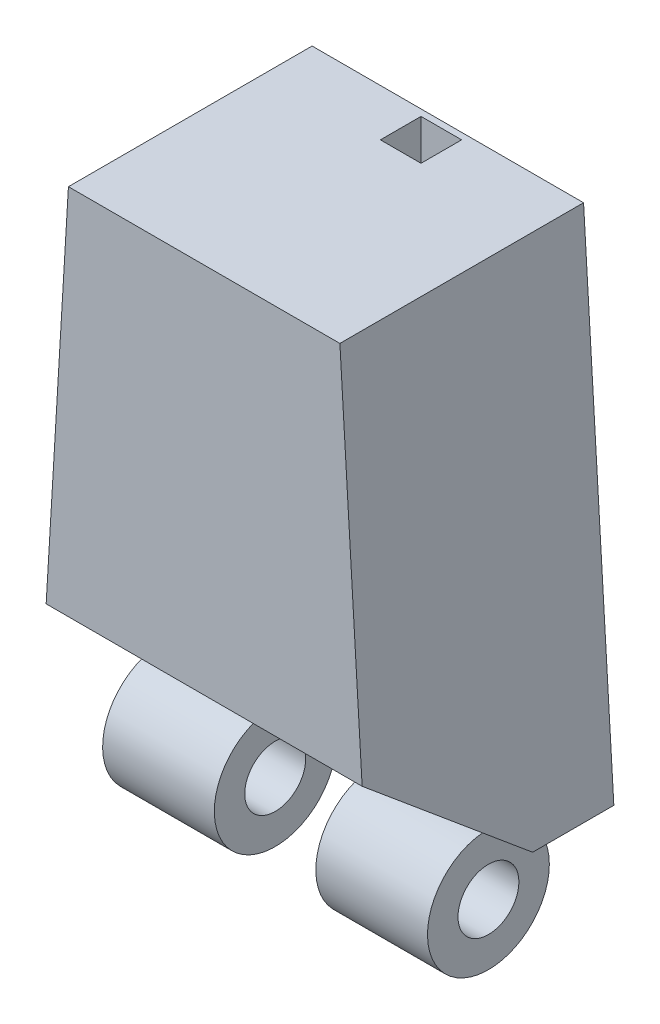
ISO-10303-21;
HEADER;
FILE_DESCRIPTION(('STEP AP214'),'2;1');
FILE_NAME('part.step','',(''),(''),'','','');
FILE_SCHEMA(('AUTOMOTIVE_DESIGN { 1 0 10303 214 1 1 1 1 }'));
ENDSEC;
DATA;
#1=APPLICATION_CONTEXT('core data for automotive mechanical design processes');
#2=APPLICATION_PROTOCOL_DEFINITION('international standard','automotive_design',2000,#1);
#3=PRODUCT_CONTEXT('',#1,'mechanical');
#4=PRODUCT('Part','Part','',(#3));
#5=PRODUCT_RELATED_PRODUCT_CATEGORY('part','',(#4));
#6=PRODUCT_DEFINITION_FORMATION('','',#4);
#7=PRODUCT_DEFINITION_CONTEXT('part definition',#1,'design');
#8=PRODUCT_DEFINITION('design','',#6,#7);
#9=PRODUCT_DEFINITION_SHAPE('','',#8);
#10=(LENGTH_UNIT() NAMED_UNIT(*) SI_UNIT(.MILLI.,.METRE.));
#11=(NAMED_UNIT(*) PLANE_ANGLE_UNIT() SI_UNIT($,.RADIAN.));
#12=(NAMED_UNIT(*) SI_UNIT($,.STERADIAN.) SOLID_ANGLE_UNIT());
#13=UNCERTAINTY_MEASURE_WITH_UNIT(LENGTH_MEASURE(1.E-05),#10,'distance_accuracy_value','');
#14=(GEOMETRIC_REPRESENTATION_CONTEXT(3) GLOBAL_UNCERTAINTY_ASSIGNED_CONTEXT((#13)) GLOBAL_UNIT_ASSIGNED_CONTEXT((#10,
#11,#12)) REPRESENTATION_CONTEXT('',''));
#15=CARTESIAN_POINT('',(0.,0.,0.));
#16=DIRECTION('',(0.,0.,1.));
#17=DIRECTION('',(1.,0.,0.));
#18=AXIS2_PLACEMENT_3D('',#15,#16,#17);
#19=CARTESIAN_POINT('',(-56.5742777997626,0.,12.));
#20=DIRECTION('',(0.,1.,0.));
#21=DIRECTION('',(0.,0.,1.));
#22=AXIS2_PLACEMENT_3D('',#19,#20,#21);
#23=PLANE('',#22);
#24=DIRECTION('',(1.,0.,0.));
#25=VECTOR('',#24,1.);
#26=CARTESIAN_POINT('',(-56.5742777997626,0.,4.));
#27=LINE('',#26,#25);
#28=CARTESIAN_POINT('',(-40.3975440170478,0.,4.));
#29=VERTEX_POINT('',#28);
#30=CARTESIAN_POINT('',(-40.2208102343331,0.,4.));
#31=VERTEX_POINT('',#30);
#32=EDGE_CURVE('E298',#29,#31,#27,.T.);
#33=ORIENTED_EDGE('',*,*,#32,.F.);
#34=DIRECTION('',(0.,0.,-1.));
#35=VECTOR('',#34,1.);
#36=CARTESIAN_POINT('',(-40.3975440170478,0.,12.));
#37=LINE('',#36,#35);
#38=CARTESIAN_POINT('',(-40.3975440170478,0.,3.20894285260943));
#39=VERTEX_POINT('',#38);
#40=EDGE_CURVE('E289',#29,#39,#37,.T.);
#41=ORIENTED_EDGE('',*,*,#40,.T.);
#42=DIRECTION('',(-1.,0.,0.));
#43=VECTOR('',#42,1.);
#44=CARTESIAN_POINT('',(-40.3975440170478,0.,3.20894285260943));
#45=LINE('',#44,#43);
#46=CARTESIAN_POINT('',(-45.8975440170478,0.,3.20894285260943));
#47=VERTEX_POINT('',#46);
#48=EDGE_CURVE('E293',#47,#39,#45,.F.);
#49=ORIENTED_EDGE('',*,*,#48,.F.);
#50=CARTESIAN_POINT('',(-50.8975440170478,0.,3.20894285260943));
#51=VERTEX_POINT('',#50);
#52=EDGE_CURVE('E299',#51,#47,#45,.F.);
#53=ORIENTED_EDGE('',*,*,#52,.F.);
#54=CARTESIAN_POINT('',(-56.3975440170478,0.,3.20894285260943));
#55=VERTEX_POINT('',#54);
#56=EDGE_CURVE('E294',#55,#51,#45,.F.);
#57=ORIENTED_EDGE('',*,*,#56,.F.);
#58=DIRECTION('',(0.,0.,-1.));
#59=VECTOR('',#58,1.);
#60=CARTESIAN_POINT('',(-56.3975440170478,0.,12.));
#61=LINE('',#60,#59);
#62=CARTESIAN_POINT('',(-56.3975440170478,0.,4.));
#63=VERTEX_POINT('',#62);
#64=EDGE_CURVE('E279',#63,#55,#61,.T.);
#65=ORIENTED_EDGE('',*,*,#64,.F.);
#66=CARTESIAN_POINT('',(-56.5742777997626,0.,4.));
#67=VERTEX_POINT('',#66);
#68=EDGE_CURVE('E300',#67,#63,#27,.T.);
#69=ORIENTED_EDGE('',*,*,#68,.F.);
#70=DIRECTION('',(0.,0.,-1.));
#71=VECTOR('',#70,1.);
#72=CARTESIAN_POINT('',(-56.5742777997626,0.,12.));
#73=LINE('',#72,#71);
#74=CARTESIAN_POINT('',(-56.5742777997626,0.,0.));
#75=VERTEX_POINT('',#74);
#76=EDGE_CURVE('E341',#67,#75,#73,.T.);
#77=ORIENTED_EDGE('',*,*,#76,.T.);
#78=DIRECTION('',(1.,0.,0.));
#79=VECTOR('',#78,1.);
#80=CARTESIAN_POINT('',(-56.5742777997626,0.,0.));
#81=LINE('',#80,#79);
#82=CARTESIAN_POINT('',(-40.2208102343331,0.,0.));
#83=VERTEX_POINT('',#82);
#84=EDGE_CURVE('E325',#75,#83,#81,.T.);
#85=ORIENTED_EDGE('',*,*,#84,.T.);
#86=DIRECTION('',(0.,0.,-1.));
#87=VECTOR('',#86,1.);
#88=CARTESIAN_POINT('',(-40.2208102343331,0.,12.));
#89=LINE('',#88,#87);
#90=EDGE_CURVE('E338',#31,#83,#89,.T.);
#91=ORIENTED_EDGE('',*,*,#90,.F.);
#92=EDGE_LOOP('',(#33,#41,#49,#53,#57,#65,#69,#77,#85,#91));
#93=FACE_BOUND('',#92,.T.);
#94=DIRECTION('',(0.,0.,1.));
#95=VECTOR('',#94,1.);
#96=CARTESIAN_POINT('',(-49.3975440170478,0.,0.));
#97=LINE('',#96,#95);
#98=CARTESIAN_POINT('',(-49.3975440170478,0.,0.32));
#99=VERTEX_POINT('',#98);
#100=CARTESIAN_POINT('',(-49.3975440170478,0.,2.32));
#101=VERTEX_POINT('',#100);
#102=EDGE_CURVE('E175',#99,#101,#97,.T.);
#103=ORIENTED_EDGE('',*,*,#102,.T.);
#104=DIRECTION('',(1.,0.,0.));
#105=VECTOR('',#104,1.);
#106=CARTESIAN_POINT('',(-49.3975440170478,0.,2.32));
#107=LINE('',#106,#105);
#108=CARTESIAN_POINT('',(-47.3975440170478,0.,2.32));
#109=VERTEX_POINT('',#108);
#110=EDGE_CURVE('E166',#101,#109,#107,.T.);
#111=ORIENTED_EDGE('',*,*,#110,.T.);
#112=DIRECTION('',(0.,0.,1.));
#113=VECTOR('',#112,1.);
#114=CARTESIAN_POINT('',(-47.3975440170478,0.,0.));
#115=LINE('',#114,#113);
#116=CARTESIAN_POINT('',(-47.3975440170478,0.,0.319999999999999));
#117=VERTEX_POINT('',#116);
#118=EDGE_CURVE('E194',#117,#109,#115,.T.);
#119=ORIENTED_EDGE('',*,*,#118,.F.);
#120=DIRECTION('',(1.,0.,0.));
#121=VECTOR('',#120,1.);
#122=CARTESIAN_POINT('',(-49.3975440170478,0.,0.32));
#123=LINE('',#122,#121);
#124=EDGE_CURVE('E56',#99,#117,#123,.T.);
#125=ORIENTED_EDGE('',*,*,#124,.F.);
#126=EDGE_LOOP('',(#103,#111,#119,#125));
#127=FACE_BOUND('',#126,.T.);
#128=ADVANCED_FACE('F40',(#93,#127),#23,.F.);
#129=CARTESIAN_POINT('',(-56.5742777997626,24.9554191747887,12.));
#130=DIRECTION('',(0.,-1.,0.));
#131=DIRECTION('',(0.,0.,-1.));
#132=AXIS2_PLACEMENT_3D('',#129,#130,#131);
#133=PLANE('',#132);
#134=DIRECTION('',(1.,0.,0.));
#135=VECTOR('',#134,1.);
#136=CARTESIAN_POINT('',(-56.5742777997626,24.9554191747887,12.));
#137=LINE('',#136,#135);
#138=CARTESIAN_POINT('',(-55.0819461306661,24.9554191747887,12.));
#139=VERTEX_POINT('',#138);
#140=CARTESIAN_POINT('',(-41.7131419034296,24.9554191747887,12.));
#141=VERTEX_POINT('',#140);
#142=EDGE_CURVE('E198',#139,#141,#137,.T.);
#143=ORIENTED_EDGE('',*,*,#142,.T.);
#144=DIRECTION('',(0.,0.,-1.));
#145=VECTOR('',#144,1.);
#146=CARTESIAN_POINT('',(-41.7131419034296,24.9554191747887,12.));
#147=LINE('',#146,#145);
#148=CARTESIAN_POINT('',(-41.7131419034296,24.9554191747887,0.));
#149=VERTEX_POINT('',#148);
#150=EDGE_CURVE('E335',#141,#149,#147,.T.);
#151=ORIENTED_EDGE('',*,*,#150,.T.);
#152=DIRECTION('',(1.,0.,0.));
#153=VECTOR('',#152,1.);
#154=CARTESIAN_POINT('',(-48.3975440170478,24.9554191747887,0.));
#155=LINE('',#154,#153);
#156=CARTESIAN_POINT('',(-55.0819461306661,24.9554191747887,0.));
#157=VERTEX_POINT('',#156);
#158=EDGE_CURVE('E364',#157,#149,#155,.T.);
#159=ORIENTED_EDGE('',*,*,#158,.F.);
#160=DIRECTION('',(0.,0.,-1.));
#161=VECTOR('',#160,1.);
#162=CARTESIAN_POINT('',(-55.0819461306661,24.9554191747887,12.));
#163=LINE('',#162,#161);
#164=EDGE_CURVE('E321',#139,#157,#163,.T.);
#165=ORIENTED_EDGE('',*,*,#164,.F.);
#166=EDGE_LOOP('',(#143,#151,#159,#165));
#167=FACE_BOUND('',#166,.T.);
#168=DIRECTION('',(0.,0.,1.));
#169=VECTOR('',#168,1.);
#170=CARTESIAN_POINT('',(-49.3975440170478,24.9554191747887,12.));
#171=LINE('',#170,#169);
#172=CARTESIAN_POINT('',(-49.3975440170478,24.9554191747887,0.32));
#173=VERTEX_POINT('',#172);
#174=CARTESIAN_POINT('',(-49.3975440170478,24.9554191747887,2.32));
#175=VERTEX_POINT('',#174);
#176=EDGE_CURVE('E11',#173,#175,#171,.T.);
#177=ORIENTED_EDGE('',*,*,#176,.F.);
#178=DIRECTION('',(-1.,0.,0.));
#179=VECTOR('',#178,1.);
#180=CARTESIAN_POINT('',(-56.5742777997626,24.9554191747887,0.320000000000001));
#181=LINE('',#180,#179);
#182=CARTESIAN_POINT('',(-47.3975440170478,24.9554191747887,0.32));
#183=VERTEX_POINT('',#182);
#184=EDGE_CURVE('E49',#183,#173,#181,.T.);
#185=ORIENTED_EDGE('',*,*,#184,.F.);
#186=DIRECTION('',(0.,0.,1.));
#187=VECTOR('',#186,1.);
#188=CARTESIAN_POINT('',(-47.3975440170478,24.9554191747887,12.));
#189=LINE('',#188,#187);
#190=CARTESIAN_POINT('',(-47.3975440170478,24.9554191747887,2.32));
#191=VERTEX_POINT('',#190);
#192=EDGE_CURVE('E368',#183,#191,#189,.T.);
#193=ORIENTED_EDGE('',*,*,#192,.T.);
#194=DIRECTION('',(1.,0.,0.));
#195=VECTOR('',#194,1.);
#196=CARTESIAN_POINT('',(-56.5742777997626,24.9554191747887,2.32));
#197=LINE('',#196,#195);
#198=EDGE_CURVE('E372',#175,#191,#197,.T.);
#199=ORIENTED_EDGE('',*,*,#198,.F.);
#200=EDGE_LOOP('',(#177,#185,#193,#199));
#201=FACE_BOUND('',#200,.T.);
#202=ADVANCED_FACE('F379',(#167,#201),#133,.F.);
#203=CARTESIAN_POINT('',(-56.5742777997626,-1.96433929006934,1.62400644488252));
#204=DIRECTION('',(0.,0.770712909441233,-0.637182557216242));
#205=DIRECTION('',(0.,0.637182557216242,0.770712909441233));
#206=AXIS2_PLACEMENT_3D('',#203,#204,#205);
#207=PLANE('',#206);
#208=DIRECTION('',(-1.,0.,0.));
#209=VECTOR('',#208,1.);
#210=CARTESIAN_POINT('',(-40.3975440170478,1.88670778135651,6.28209329801413));
#211=LINE('',#210,#209);
#212=CARTESIAN_POINT('',(-40.3975440170478,1.88670778135651,6.28209329801413));
#213=VERTEX_POINT('',#212);
#214=CARTESIAN_POINT('',(-45.8975440170478,1.88670778135651,6.28209329801413));
#215=VERTEX_POINT('',#214);
#216=EDGE_CURVE('E352',#213,#215,#211,.T.);
#217=ORIENTED_EDGE('',*,*,#216,.F.);
#218=DIRECTION('',(0.,-0.637182557216242,-0.770712909441233));
#219=VECTOR('',#218,1.);
#220=CARTESIAN_POINT('',(-40.3975440170478,-1.96433929006934,1.62400644488252));
#221=LINE('',#220,#219);
#222=EDGE_CURVE('E356',#213,#29,#221,.T.);
#223=ORIENTED_EDGE('',*,*,#222,.T.);
#224=ORIENTED_EDGE('',*,*,#32,.T.);
#225=DIRECTION('',(0.0380758250929249,-0.636720506102474,-0.770154029173452));
#226=VECTOR('',#225,1.);
#227=CARTESIAN_POINT('',(-40.4554042352084,3.92298290585744,8.74509782921682));
#228=LINE('',#227,#226);
#229=CARTESIAN_POINT('',(-40.6163241045524,6.6139549439046,12.));
#230=VERTEX_POINT('',#229);
#231=EDGE_CURVE('E303',#230,#31,#228,.T.);
#232=ORIENTED_EDGE('',*,*,#231,.F.);
#233=DIRECTION('',(-1.,0.,0.));
#234=VECTOR('',#233,1.);
#235=CARTESIAN_POINT('',(-48.3975440170478,6.6139549439046,12.));
#236=LINE('',#235,#234);
#237=CARTESIAN_POINT('',(-56.1787639295432,6.61395494390459,12.));
#238=VERTEX_POINT('',#237);
#239=EDGE_CURVE('E344',#230,#238,#236,.T.);
#240=ORIENTED_EDGE('',*,*,#239,.T.);
#241=DIRECTION('',(0.0380758250929245,0.636720506102474,0.770154029173452));
#242=VECTOR('',#241,1.);
#243=CARTESIAN_POINT('',(-56.3396837988872,3.92298290585744,8.74509782921682));
#244=LINE('',#243,#242);
#245=EDGE_CURVE('E307',#67,#238,#244,.T.);
#246=ORIENTED_EDGE('',*,*,#245,.F.);
#247=ORIENTED_EDGE('',*,*,#68,.T.);
#248=DIRECTION('',(0.,-0.637182557216242,-0.770712909441233));
#249=VECTOR('',#248,1.);
#250=CARTESIAN_POINT('',(-56.3975440170478,-1.96433929006934,1.62400644488252));
#251=LINE('',#250,#249);
#252=CARTESIAN_POINT('',(-56.3975440170478,1.88670778135651,6.28209329801413));
#253=VERTEX_POINT('',#252);
#254=EDGE_CURVE('E347',#253,#63,#251,.T.);
#255=ORIENTED_EDGE('',*,*,#254,.F.);
#256=CARTESIAN_POINT('',(-50.8975440170478,1.88670778135651,6.28209329801413));
#257=VERTEX_POINT('',#256);
#258=EDGE_CURVE('E351',#257,#253,#211,.T.);
#259=ORIENTED_EDGE('',*,*,#258,.F.);
#260=EDGE_CURVE('E357',#215,#257,#211,.T.);
#261=ORIENTED_EDGE('',*,*,#260,.F.);
#262=EDGE_LOOP('',(#217,#223,#224,#232,#240,#246,#247,#255,#259,#261));
#263=FACE_BOUND('',#262,.T.);
#264=DIRECTION('',(0.,-0.637182557216242,-0.770712909441233));
#265=VECTOR('',#264,1.);
#266=CARTESIAN_POINT('',(-53.3975440170478,2.61388104101718,7.16165569700607));
#267=LINE('',#266,#265);
#268=CARTESIAN_POINT('',(-53.3975440170478,5.79979382709839,11.0152202442122));
#269=VERTEX_POINT('',#268);
#270=CARTESIAN_POINT('',(-53.3975440170478,2.61388104101718,7.16165569700607));
#271=VERTEX_POINT('',#270);
#272=EDGE_CURVE('E220',#269,#271,#267,.T.);
#273=ORIENTED_EDGE('',*,*,#272,.F.);
#274=DIRECTION('',(1.,0.,0.));
#275=VECTOR('',#274,1.);
#276=CARTESIAN_POINT('',(-53.3975440170478,5.79979382709839,11.0152202442122));
#277=LINE('',#276,#275);
#278=CARTESIAN_POINT('',(-43.3975440170478,5.79979382709839,11.0152202442122));
#279=VERTEX_POINT('',#278);
#280=EDGE_CURVE('E243',#269,#279,#277,.T.);
#281=ORIENTED_EDGE('',*,*,#280,.T.);
#282=DIRECTION('',(0.,-0.637182557216242,-0.770712909441233));
#283=VECTOR('',#282,1.);
#284=CARTESIAN_POINT('',(-43.3975440170478,2.61388104101718,7.16165569700607));
#285=LINE('',#284,#283);
#286=CARTESIAN_POINT('',(-43.3975440170478,2.61388104101718,7.16165569700607));
#287=VERTEX_POINT('',#286);
#288=EDGE_CURVE('E212',#279,#287,#285,.T.);
#289=ORIENTED_EDGE('',*,*,#288,.T.);
#290=DIRECTION('',(1.,0.,0.));
#291=VECTOR('',#290,1.);
#292=CARTESIAN_POINT('',(-53.3975440170478,2.61388104101718,7.16165569700607));
#293=LINE('',#292,#291);
#294=EDGE_CURVE('E238',#271,#287,#293,.T.);
#295=ORIENTED_EDGE('',*,*,#294,.F.);
#296=EDGE_LOOP('',(#273,#281,#289,#295));
#297=FACE_BOUND('',#296,.T.);
#298=ADVANCED_FACE('F394',(#263,#297),#207,.F.);
#299=CARTESIAN_POINT('',(-40.3975440170478,-1.1,6.));
#300=DIRECTION('',(-1.,0.,0.));
#301=DIRECTION('',(0.,0.,1.));
#302=AXIS2_PLACEMENT_3D('',#299,#300,#301);
#303=CYLINDRICAL_SURFACE('',#302,3.);
#304=CARTESIAN_POINT('',(-50.8975440170478,-1.1,6.));
#305=DIRECTION('',(1.,0.,0.));
#306=DIRECTION('',(0.,0.,-1.));
#307=AXIS2_PLACEMENT_3D('',#304,#305,#306);
#308=CIRCLE('',#307,3.);
#309=EDGE_CURVE('E257',#257,#51,#308,.T.);
#310=ORIENTED_EDGE('',*,*,#309,.F.);
#311=ORIENTED_EDGE('',*,*,#258,.T.);
#312=CARTESIAN_POINT('',(-56.3975440170478,-1.1,6.));
#313=DIRECTION('',(1.,0.,0.));
#314=DIRECTION('',(0.,0.,-1.));
#315=AXIS2_PLACEMENT_3D('',#312,#313,#314);
#316=CIRCLE('',#315,3.);
#317=EDGE_CURVE('E261',#253,#55,#316,.T.);
#318=ORIENTED_EDGE('',*,*,#317,.T.);
#319=ORIENTED_EDGE('',*,*,#56,.T.);
#320=EDGE_LOOP('',(#310,#311,#318,#319));
#321=FACE_BOUND('',#320,.T.);
#322=ADVANCED_FACE('F413',(#321),#303,.T.);
#323=CARTESIAN_POINT('',(-40.3975440170478,-1.1,6.));
#324=DIRECTION('',(-1.,0.,0.));
#325=DIRECTION('',(0.,0.,1.));
#326=AXIS2_PLACEMENT_3D('',#323,#324,#325);
#327=CYLINDRICAL_SURFACE('',#326,1.5);
#328=CARTESIAN_POINT('',(-56.3975440170478,-1.1,6.));
#329=DIRECTION('',(1.,0.,0.));
#330=DIRECTION('',(0.,0.,-1.));
#331=AXIS2_PLACEMENT_3D('',#328,#329,#330);
#332=CIRCLE('',#331,1.5);
#333=CARTESIAN_POINT('',(-56.3975440170478,-1.1,4.5));
#334=VERTEX_POINT('',#333);
#335=EDGE_CURVE('E275',#334,#334,#332,.T.);
#336=ORIENTED_EDGE('',*,*,#335,.F.);
#337=EDGE_LOOP('',(#336));
#338=FACE_BOUND('',#337,.T.);
#339=CARTESIAN_POINT('',(-50.8975440170478,-1.1,6.));
#340=DIRECTION('',(1.,0.,0.));
#341=DIRECTION('',(0.,0.,-1.));
#342=AXIS2_PLACEMENT_3D('',#339,#340,#341);
#343=CIRCLE('',#342,1.5);
#344=CARTESIAN_POINT('',(-50.8975440170478,-1.1,4.5));
#345=VERTEX_POINT('',#344);
#346=EDGE_CURVE('E256',#345,#345,#343,.T.);
#347=ORIENTED_EDGE('',*,*,#346,.T.);
#348=EDGE_LOOP('',(#347));
#349=FACE_BOUND('',#348,.T.);
#350=ADVANCED_FACE('F425',(#338,#349),#327,.F.);
#351=CARTESIAN_POINT('',(-56.5742777997626,0.,12.));
#352=DIRECTION('',(0.998216766991548,-0.0596932667638597,0.));
#353=DIRECTION('',(0.0596932667638597,0.998216766991548,0.));
#354=AXIS2_PLACEMENT_3D('',#351,#352,#353);
#355=PLANE('',#354);
#356=ORIENTED_EDGE('',*,*,#76,.F.);
#357=ORIENTED_EDGE('',*,*,#245,.T.);
#358=DIRECTION('',(-0.0596932667638597,-0.998216766991548,0.));
#359=VECTOR('',#358,1.);
#360=CARTESIAN_POINT('',(-56.5742777997626,0.,12.));
#361=LINE('',#360,#359);
#362=EDGE_CURVE('E312',#139,#238,#361,.T.);
#363=ORIENTED_EDGE('',*,*,#362,.F.);
#364=ORIENTED_EDGE('',*,*,#164,.T.);
#365=DIRECTION('',(-0.0596932667638597,-0.998216766991548,0.));
#366=VECTOR('',#365,1.);
#367=CARTESIAN_POINT('',(-56.5742777997626,0.,0.));
#368=LINE('',#367,#366);
#369=EDGE_CURVE('E311',#157,#75,#368,.T.);
#370=ORIENTED_EDGE('',*,*,#369,.T.);
#371=EDGE_LOOP('',(#356,#357,#363,#364,#370));
#372=FACE_BOUND('',#371,.T.);
#373=ADVANCED_FACE('F42',(#372),#355,.F.);
#374=CARTESIAN_POINT('',(-40.2208102343331,0.,12.));
#375=DIRECTION('',(-0.998216766991548,-0.0596932667638603,0.));
#376=DIRECTION('',(0.0596932667638603,-0.998216766991548,0.));
#377=AXIS2_PLACEMENT_3D('',#374,#375,#376);
#378=PLANE('',#377);
#379=DIRECTION('',(-0.0596932667638603,0.998216766991548,0.));
#380=VECTOR('',#379,1.);
#381=CARTESIAN_POINT('',(-40.2208102343331,0.,12.));
#382=LINE('',#381,#380);
#383=EDGE_CURVE('E316',#230,#141,#382,.T.);
#384=ORIENTED_EDGE('',*,*,#383,.F.);
#385=ORIENTED_EDGE('',*,*,#231,.T.);
#386=ORIENTED_EDGE('',*,*,#90,.T.);
#387=DIRECTION('',(-0.0596932667638603,0.998216766991548,0.));
#388=VECTOR('',#387,1.);
#389=CARTESIAN_POINT('',(-40.2208102343331,0.,0.));
#390=LINE('',#389,#388);
#391=EDGE_CURVE('E317',#83,#149,#390,.T.);
#392=ORIENTED_EDGE('',*,*,#391,.T.);
#393=ORIENTED_EDGE('',*,*,#150,.F.);
#394=EDGE_LOOP('',(#384,#385,#386,#392,#393));
#395=FACE_BOUND('',#394,.T.);
#396=ADVANCED_FACE('F399',(#395),#378,.F.);
#397=CARTESIAN_POINT('',(-48.3975440170478,24.9554191747887,12.));
#398=DIRECTION('',(0.,0.,1.));
#399=DIRECTION('',(1.,0.,0.));
#400=AXIS2_PLACEMENT_3D('',#397,#398,#399);
#401=PLANE('',#400);
#402=ORIENTED_EDGE('',*,*,#142,.F.);
#403=ORIENTED_EDGE('',*,*,#362,.T.);
#404=ORIENTED_EDGE('',*,*,#239,.F.);
#405=ORIENTED_EDGE('',*,*,#383,.T.);
#406=EDGE_LOOP('',(#402,#403,#404,#405));
#407=FACE_BOUND('',#406,.T.);
#408=ADVANCED_FACE('F402',(#407),#401,.T.);
#409=CARTESIAN_POINT('',(-48.3975440170478,24.9554191747887,0.));
#410=DIRECTION('',(0.,0.,1.));
#411=DIRECTION('',(1.,0.,0.));
#412=AXIS2_PLACEMENT_3D('',#409,#410,#411);
#413=PLANE('',#412);
#414=ORIENTED_EDGE('',*,*,#369,.F.);
#415=ORIENTED_EDGE('',*,*,#158,.T.);
#416=ORIENTED_EDGE('',*,*,#391,.F.);
#417=ORIENTED_EDGE('',*,*,#84,.F.);
#418=EDGE_LOOP('',(#414,#415,#416,#417));
#419=FACE_BOUND('',#418,.T.);
#420=ADVANCED_FACE('F404',(#419),#413,.F.);
#421=ORIENTED_EDGE('',*,*,#216,.T.);
#422=CARTESIAN_POINT('',(-45.8975440170478,-1.1,6.));
#423=DIRECTION('',(1.,0.,0.));
#424=DIRECTION('',(0.,0.,-1.));
#425=AXIS2_PLACEMENT_3D('',#422,#423,#424);
#426=CIRCLE('',#425,3.);
#427=EDGE_CURVE('E242',#215,#47,#426,.T.);
#428=ORIENTED_EDGE('',*,*,#427,.T.);
#429=ORIENTED_EDGE('',*,*,#48,.T.);
#430=CARTESIAN_POINT('',(-40.3975440170478,-1.1,6.));
#431=DIRECTION('',(1.,0.,0.));
#432=DIRECTION('',(0.,0.,-1.));
#433=AXIS2_PLACEMENT_3D('',#430,#431,#432);
#434=CIRCLE('',#433,3.);
#435=EDGE_CURVE('E270',#213,#39,#434,.T.);
#436=ORIENTED_EDGE('',*,*,#435,.F.);
#437=EDGE_LOOP('',(#421,#428,#429,#436));
#438=FACE_BOUND('',#437,.T.);
#439=ADVANCED_FACE('F406',(#438),#303,.T.);
#440=CARTESIAN_POINT('',(-40.3975440170478,0.,0.));
#441=DIRECTION('',(1.,0.,0.));
#442=DIRECTION('',(0.,0.,-1.));
#443=AXIS2_PLACEMENT_3D('',#440,#441,#442);
#444=PLANE('',#443);
#445=CARTESIAN_POINT('',(-40.3975440170478,-1.1,6.));
#446=DIRECTION('',(1.,0.,0.));
#447=DIRECTION('',(0.,0.,-1.));
#448=AXIS2_PLACEMENT_3D('',#445,#446,#447);
#449=CIRCLE('',#448,1.5);
#450=CARTESIAN_POINT('',(-40.3975440170478,-1.1,4.5));
#451=VERTEX_POINT('',#450);
#452=EDGE_CURVE('E274',#451,#451,#449,.T.);
#453=ORIENTED_EDGE('',*,*,#452,.F.);
#454=EDGE_LOOP('',(#453));
#455=FACE_BOUND('',#454,.T.);
#456=ORIENTED_EDGE('',*,*,#40,.F.);
#457=ORIENTED_EDGE('',*,*,#222,.F.);
#458=ORIENTED_EDGE('',*,*,#435,.T.);
#459=EDGE_LOOP('',(#456,#457,#458));
#460=FACE_BOUND('',#459,.T.);
#461=ADVANCED_FACE('F417',(#455,#460),#444,.T.);
#462=CARTESIAN_POINT('',(-56.3975440170478,0.,0.));
#463=DIRECTION('',(1.,0.,0.));
#464=DIRECTION('',(0.,0.,-1.));
#465=AXIS2_PLACEMENT_3D('',#462,#463,#464);
#466=PLANE('',#465);
#467=ORIENTED_EDGE('',*,*,#335,.T.);
#468=EDGE_LOOP('',(#467));
#469=FACE_BOUND('',#468,.T.);
#470=ORIENTED_EDGE('',*,*,#254,.T.);
#471=ORIENTED_EDGE('',*,*,#64,.T.);
#472=ORIENTED_EDGE('',*,*,#317,.F.);
#473=EDGE_LOOP('',(#470,#471,#472));
#474=FACE_BOUND('',#473,.T.);
#475=ADVANCED_FACE('F423',(#469,#474),#466,.F.);
#476=CARTESIAN_POINT('',(-45.8975440170478,-1.1,6.));
#477=DIRECTION('',(1.,0.,0.));
#478=DIRECTION('',(0.,0.,-1.));
#479=AXIS2_PLACEMENT_3D('',#476,#477,#478);
#480=CIRCLE('',#479,1.5);
#481=CARTESIAN_POINT('',(-45.8975440170478,-1.1,4.5));
#482=VERTEX_POINT('',#481);
#483=EDGE_CURVE('E266',#482,#482,#480,.T.);
#484=ORIENTED_EDGE('',*,*,#483,.F.);
#485=EDGE_LOOP('',(#484));
#486=FACE_BOUND('',#485,.T.);
#487=ORIENTED_EDGE('',*,*,#452,.T.);
#488=EDGE_LOOP('',(#487));
#489=FACE_BOUND('',#488,.T.);
#490=ADVANCED_FACE('F419',(#486,#489),#327,.F.);
#491=CARTESIAN_POINT('',(-50.8975440170478,-1.1,6.));
#492=DIRECTION('',(1.,0.,0.));
#493=DIRECTION('',(0.,0.,-1.));
#494=AXIS2_PLACEMENT_3D('',#491,#492,#493);
#495=CYLINDRICAL_SURFACE('',#494,3.);
#496=EDGE_CURVE('E262',#47,#215,#426,.T.);
#497=ORIENTED_EDGE('',*,*,#496,.T.);
#498=ORIENTED_EDGE('',*,*,#260,.T.);
#499=EDGE_CURVE('E252',#51,#257,#308,.T.);
#500=ORIENTED_EDGE('',*,*,#499,.F.);
#501=ORIENTED_EDGE('',*,*,#52,.T.);
#502=EDGE_LOOP('',(#497,#498,#500,#501));
#503=FACE_BOUND('',#502,.T.);
#504=ADVANCED_FACE('F422',(#503),#495,.F.);
#505=CARTESIAN_POINT('',(-50.8975440170478,0.,0.));
#506=DIRECTION('',(1.,0.,0.));
#507=DIRECTION('',(0.,0.,-1.));
#508=AXIS2_PLACEMENT_3D('',#505,#506,#507);
#509=PLANE('',#508);
#510=ORIENTED_EDGE('',*,*,#499,.T.);
#511=ORIENTED_EDGE('',*,*,#309,.T.);
#512=EDGE_LOOP('',(#510,#511));
#513=FACE_BOUND('',#512,.T.);
#514=ORIENTED_EDGE('',*,*,#346,.F.);
#515=EDGE_LOOP('',(#514));
#516=FACE_BOUND('',#515,.T.);
#517=ADVANCED_FACE('F434',(#513,#516),#509,.T.);
#518=CARTESIAN_POINT('',(-45.8975440170478,0.,0.));
#519=DIRECTION('',(1.,0.,0.));
#520=DIRECTION('',(0.,0.,-1.));
#521=AXIS2_PLACEMENT_3D('',#518,#519,#520);
#522=PLANE('',#521);
#523=ORIENTED_EDGE('',*,*,#496,.F.);
#524=ORIENTED_EDGE('',*,*,#427,.F.);
#525=EDGE_LOOP('',(#523,#524));
#526=FACE_BOUND('',#525,.T.);
#527=ORIENTED_EDGE('',*,*,#483,.T.);
#528=EDGE_LOOP('',(#527));
#529=FACE_BOUND('',#528,.T.);
#530=ADVANCED_FACE('F436',(#526,#529),#522,.F.);
#531=CARTESIAN_POINT('',(-53.3975440170478,2.61388104101718,7.16165569700607));
#532=DIRECTION('',(0.,-0.637182557216242,-0.770712909441233));
#533=DIRECTION('',(0.,0.770712909441233,-0.637182557216242));
#534=AXIS2_PLACEMENT_3D('',#531,#532,#533);
#535=PLANE('',#534);
#536=DIRECTION('',(0.,0.770712909441233,-0.637182557216243));
#537=VECTOR('',#536,1.);
#538=CARTESIAN_POINT('',(-43.3975440170478,2.61388104101718,7.16165569700607));
#539=LINE('',#538,#537);
#540=CARTESIAN_POINT('',(-43.3975440170478,6.46744558822334,3.97574291092486));
#541=VERTEX_POINT('',#540);
#542=EDGE_CURVE('E206',#287,#541,#539,.T.);
#543=ORIENTED_EDGE('',*,*,#542,.T.);
#544=DIRECTION('',(1.,0.,0.));
#545=VECTOR('',#544,1.);
#546=CARTESIAN_POINT('',(-53.3975440170478,6.46744558822334,3.97574291092486));
#547=LINE('',#546,#545);
#548=CARTESIAN_POINT('',(-53.3975440170478,6.46744558822334,3.97574291092486));
#549=VERTEX_POINT('',#548);
#550=EDGE_CURVE('E224',#549,#541,#547,.T.);
#551=ORIENTED_EDGE('',*,*,#550,.F.);
#552=DIRECTION('',(0.,0.770712909441233,-0.637182557216243));
#553=VECTOR('',#552,1.);
#554=CARTESIAN_POINT('',(-53.3975440170478,2.61388104101718,7.16165569700607));
#555=LINE('',#554,#553);
#556=EDGE_CURVE('E207',#271,#549,#555,.T.);
#557=ORIENTED_EDGE('',*,*,#556,.F.);
#558=ORIENTED_EDGE('',*,*,#294,.T.);
#559=EDGE_LOOP('',(#543,#551,#557,#558));
#560=FACE_BOUND('',#559,.T.);
#561=ADVANCED_FACE('F439',(#560),#535,.F.);
#562=CARTESIAN_POINT('',(-53.3975440170478,9.65335837430456,7.82930745813102));
#563=DIRECTION('',(0.,0.637182557216242,0.770712909441233));
#564=DIRECTION('',(0.,-0.770712909441233,0.637182557216243));
#565=AXIS2_PLACEMENT_3D('',#562,#563,#564);
#566=PLANE('',#565);
#567=DIRECTION('',(0.,-0.770712909441233,0.637182557216242));
#568=VECTOR('',#567,1.);
#569=CARTESIAN_POINT('',(-43.3975440170478,9.65335837430456,7.82930745813102));
#570=LINE('',#569,#568);
#571=CARTESIAN_POINT('',(-43.3975440170478,9.65335837430456,7.82930745813102));
#572=VERTEX_POINT('',#571);
#573=EDGE_CURVE('E232',#572,#279,#570,.T.);
#574=ORIENTED_EDGE('',*,*,#573,.T.);
#575=ORIENTED_EDGE('',*,*,#280,.F.);
#576=DIRECTION('',(0.,-0.770712909441233,0.637182557216242));
#577=VECTOR('',#576,1.);
#578=CARTESIAN_POINT('',(-53.3975440170478,9.65335837430456,7.82930745813102));
#579=LINE('',#578,#577);
#580=CARTESIAN_POINT('',(-53.3975440170478,9.65335837430456,7.82930745813102));
#581=VERTEX_POINT('',#580);
#582=EDGE_CURVE('E216',#581,#269,#579,.T.);
#583=ORIENTED_EDGE('',*,*,#582,.F.);
#584=DIRECTION('',(1.,0.,0.));
#585=VECTOR('',#584,1.);
#586=CARTESIAN_POINT('',(-53.3975440170478,9.65335837430456,7.82930745813102));
#587=LINE('',#586,#585);
#588=EDGE_CURVE('E247',#581,#572,#587,.T.);
#589=ORIENTED_EDGE('',*,*,#588,.T.);
#590=EDGE_LOOP('',(#574,#575,#583,#589));
#591=FACE_BOUND('',#590,.T.);
#592=ADVANCED_FACE('F446',(#591),#566,.F.);
#593=CARTESIAN_POINT('',(-53.3975440170478,6.46744558822334,3.97574291092486));
#594=DIRECTION('',(0.,0.770712909441232,-0.637182557216243));
#595=DIRECTION('',(0.,0.637182557216243,0.770712909441232));
#596=AXIS2_PLACEMENT_3D('',#593,#594,#595);
#597=PLANE('',#596);
#598=DIRECTION('',(0.,0.637182557216243,0.770712909441232));
#599=VECTOR('',#598,1.);
#600=CARTESIAN_POINT('',(-43.3975440170478,6.46744558822334,3.97574291092486));
#601=LINE('',#600,#599);
#602=EDGE_CURVE('E228',#541,#572,#601,.T.);
#603=ORIENTED_EDGE('',*,*,#602,.T.);
#604=ORIENTED_EDGE('',*,*,#588,.F.);
#605=DIRECTION('',(0.,0.637182557216243,0.770712909441232));
#606=VECTOR('',#605,1.);
#607=CARTESIAN_POINT('',(-53.3975440170478,6.46744558822334,3.97574291092486));
#608=LINE('',#607,#606);
#609=EDGE_CURVE('E211',#549,#581,#608,.T.);
#610=ORIENTED_EDGE('',*,*,#609,.F.);
#611=ORIENTED_EDGE('',*,*,#550,.T.);
#612=EDGE_LOOP('',(#603,#604,#610,#611));
#613=FACE_BOUND('',#612,.T.);
#614=ADVANCED_FACE('F448',(#613),#597,.F.);
#615=CARTESIAN_POINT('',(-53.3975440170478,0.,0.));
#616=DIRECTION('',(1.,0.,0.));
#617=DIRECTION('',(0.,0.,-1.));
#618=AXIS2_PLACEMENT_3D('',#615,#616,#617);
#619=PLANE('',#618);
#620=CARTESIAN_POINT('',(-53.3975440170478,6.17711363623363,7.54809025596646));
#621=DIRECTION('',(1.,0.,0.));
#622=DIRECTION('',(0.,0.,-1.));
#623=AXIS2_PLACEMENT_3D('',#620,#621,#622);
#624=CIRCLE('',#623,1.5);
#625=CARTESIAN_POINT('',(-53.3975440170478,6.17711363623363,6.04809025596646));
#626=VERTEX_POINT('',#625);
#627=EDGE_CURVE('E202',#626,#626,#624,.F.);
#628=ORIENTED_EDGE('',*,*,#627,.T.);
#629=EDGE_LOOP('',(#628));
#630=FACE_BOUND('',#629,.T.);
#631=ORIENTED_EDGE('',*,*,#556,.T.);
#632=ORIENTED_EDGE('',*,*,#609,.T.);
#633=ORIENTED_EDGE('',*,*,#582,.T.);
#634=ORIENTED_EDGE('',*,*,#272,.T.);
#635=EDGE_LOOP('',(#631,#632,#633,#634));
#636=FACE_BOUND('',#635,.T.);
#637=ADVANCED_FACE('F451',(#630,#636),#619,.T.);
#638=CARTESIAN_POINT('',(-43.3975440170478,0.,0.));
#639=DIRECTION('',(1.,0.,0.));
#640=DIRECTION('',(0.,0.,-1.));
#641=AXIS2_PLACEMENT_3D('',#638,#639,#640);
#642=PLANE('',#641);
#643=CARTESIAN_POINT('',(-43.3975440170478,6.17711363623363,7.54809025596646));
#644=DIRECTION('',(1.,0.,0.));
#645=DIRECTION('',(0.,0.,-1.));
#646=AXIS2_PLACEMENT_3D('',#643,#644,#645);
#647=CIRCLE('',#646,1.5);
#648=CARTESIAN_POINT('',(-43.3975440170478,6.17711363623363,6.04809025596646));
#649=VERTEX_POINT('',#648);
#650=EDGE_CURVE('E360',#649,#649,#647,.F.);
#651=ORIENTED_EDGE('',*,*,#650,.F.);
#652=EDGE_LOOP('',(#651));
#653=FACE_BOUND('',#652,.T.);
#654=ORIENTED_EDGE('',*,*,#542,.F.);
#655=ORIENTED_EDGE('',*,*,#288,.F.);
#656=ORIENTED_EDGE('',*,*,#573,.F.);
#657=ORIENTED_EDGE('',*,*,#602,.F.);
#658=EDGE_LOOP('',(#654,#655,#656,#657));
#659=FACE_BOUND('',#658,.T.);
#660=ADVANCED_FACE('F456',(#653,#659),#642,.F.);
#661=CARTESIAN_POINT('',(-42.8975440170478,6.17711363623363,7.54809025596646));
#662=DIRECTION('',(-1.,0.,0.));
#663=DIRECTION('',(0.,0.,1.));
#664=AXIS2_PLACEMENT_3D('',#661,#662,#663);
#665=CYLINDRICAL_SURFACE('',#664,1.5);
#666=ORIENTED_EDGE('',*,*,#627,.F.);
#667=EDGE_LOOP('',(#666));
#668=FACE_BOUND('',#667,.T.);
#669=ORIENTED_EDGE('',*,*,#650,.T.);
#670=EDGE_LOOP('',(#669));
#671=FACE_BOUND('',#670,.T.);
#672=ADVANCED_FACE('F459',(#668,#671),#665,.T.);
#673=CARTESIAN_POINT('',(-49.3975440170478,0.,0.32));
#674=DIRECTION('',(0.,0.,1.));
#675=DIRECTION('',(1.,0.,0.));
#676=AXIS2_PLACEMENT_3D('',#673,#674,#675);
#677=PLANE('',#676);
#678=ORIENTED_EDGE('',*,*,#184,.T.);
#679=DIRECTION('',(0.,-1.,0.));
#680=VECTOR('',#679,1.);
#681=CARTESIAN_POINT('',(-49.3975440170478,0.,0.32));
#682=LINE('',#681,#680);
#683=EDGE_CURVE('E183',#173,#99,#682,.T.);
#684=ORIENTED_EDGE('',*,*,#683,.T.);
#685=ORIENTED_EDGE('',*,*,#124,.T.);
#686=DIRECTION('',(0.,-1.,0.));
#687=VECTOR('',#686,1.);
#688=CARTESIAN_POINT('',(-47.3975440170478,0.,0.32));
#689=LINE('',#688,#687);
#690=EDGE_CURVE('E189',#183,#117,#689,.T.);
#691=ORIENTED_EDGE('',*,*,#690,.F.);
#692=EDGE_LOOP('',(#678,#684,#685,#691));
#693=FACE_BOUND('',#692,.T.);
#694=ADVANCED_FACE('F376',(#693),#677,.T.);
#695=CARTESIAN_POINT('',(-49.3975440170478,0.,2.32));
#696=DIRECTION('',(0.,0.,-1.));
#697=DIRECTION('',(-1.,0.,0.));
#698=AXIS2_PLACEMENT_3D('',#695,#696,#697);
#699=PLANE('',#698);
#700=ORIENTED_EDGE('',*,*,#198,.T.);
#701=DIRECTION('',(0.,1.,0.));
#702=VECTOR('',#701,1.);
#703=CARTESIAN_POINT('',(-47.3975440170478,0.,2.32));
#704=LINE('',#703,#702);
#705=EDGE_CURVE('E64',#109,#191,#704,.T.);
#706=ORIENTED_EDGE('',*,*,#705,.F.);
#707=ORIENTED_EDGE('',*,*,#110,.F.);
#708=DIRECTION('',(0.,1.,0.));
#709=VECTOR('',#708,1.);
#710=CARTESIAN_POINT('',(-49.3975440170478,0.,2.32));
#711=LINE('',#710,#709);
#712=EDGE_CURVE('E169',#101,#175,#711,.T.);
#713=ORIENTED_EDGE('',*,*,#712,.T.);
#714=EDGE_LOOP('',(#700,#706,#707,#713));
#715=FACE_BOUND('',#714,.T.);
#716=ADVANCED_FACE('F168',(#715),#699,.T.);
#717=CARTESIAN_POINT('',(-49.3975440170478,0.,0.));
#718=DIRECTION('',(1.,0.,0.));
#719=DIRECTION('',(0.,0.,-1.));
#720=AXIS2_PLACEMENT_3D('',#717,#718,#719);
#721=PLANE('',#720);
#722=ORIENTED_EDGE('',*,*,#176,.T.);
#723=ORIENTED_EDGE('',*,*,#712,.F.);
#724=ORIENTED_EDGE('',*,*,#102,.F.);
#725=ORIENTED_EDGE('',*,*,#683,.F.);
#726=EDGE_LOOP('',(#722,#723,#724,#725));
#727=FACE_BOUND('',#726,.T.);
#728=ADVANCED_FACE('F179',(#727),#721,.T.);
#729=CARTESIAN_POINT('',(-47.3975440170478,0.,0.));
#730=DIRECTION('',(1.,0.,0.));
#731=DIRECTION('',(0.,0.,-1.));
#732=AXIS2_PLACEMENT_3D('',#729,#730,#731);
#733=PLANE('',#732);
#734=ORIENTED_EDGE('',*,*,#690,.T.);
#735=ORIENTED_EDGE('',*,*,#118,.T.);
#736=ORIENTED_EDGE('',*,*,#705,.T.);
#737=ORIENTED_EDGE('',*,*,#192,.F.);
#738=EDGE_LOOP('',(#734,#735,#736,#737));
#739=FACE_BOUND('',#738,.T.);
#740=ADVANCED_FACE('F380',(#739),#733,.F.);
#741=CLOSED_SHELL('',(#128,#202,#298,#322,#350,#373,#396,#408,#420,#439,#461,#475,#490,#504,
#517,#530,#561,#592,#614,#637,#660,#672,#694,#716,#728,#740));
#742=MANIFOLD_SOLID_BREP('B2',#741);
#743=ADVANCED_BREP_SHAPE_REPRESENTATION('',(#18,#742),#14);
#744=SHAPE_DEFINITION_REPRESENTATION(#9,#743);
ENDSEC;
END-ISO-10303-21;
